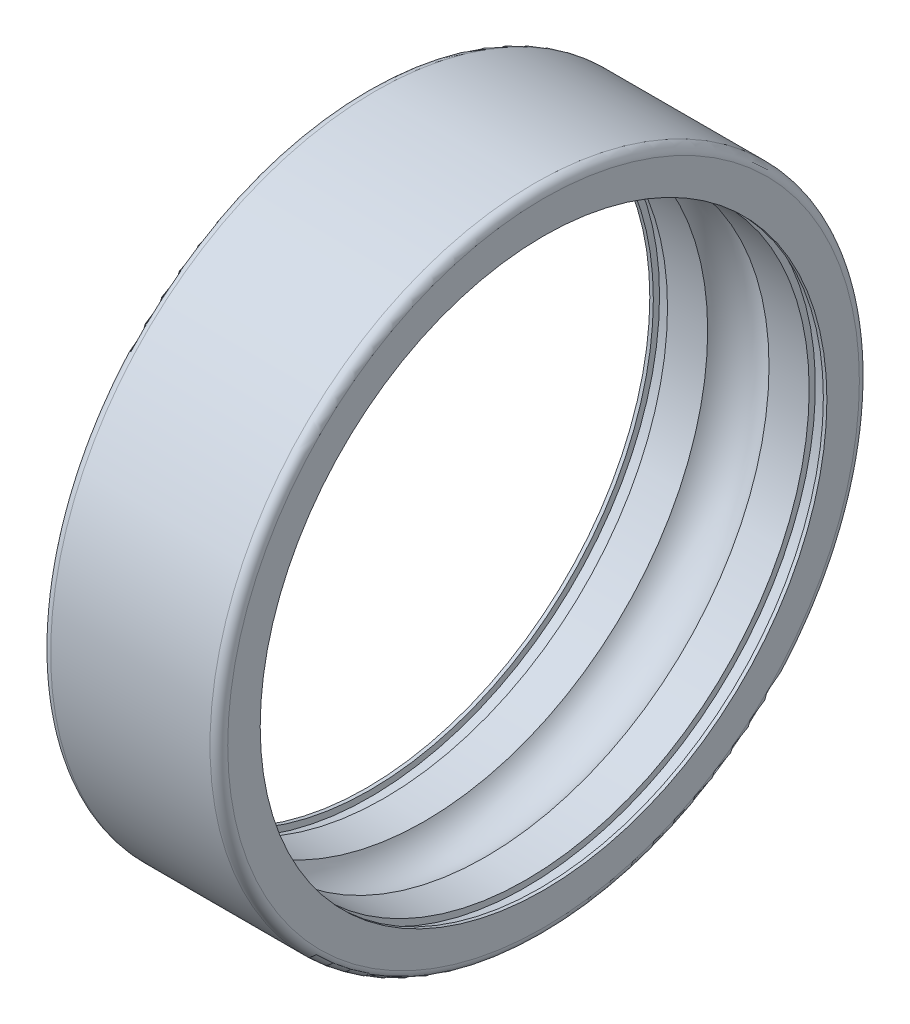
ISO-10303-21;
HEADER;
FILE_DESCRIPTION(('STEP AP214'),'2;1');
FILE_NAME('part.step','',(''),(''),'','','');
FILE_SCHEMA(('AUTOMOTIVE_DESIGN { 1 0 10303 214 1 1 1 1 }'));
ENDSEC;
DATA;
#1=APPLICATION_CONTEXT('core data for automotive mechanical design processes');
#2=APPLICATION_PROTOCOL_DEFINITION('international standard','automotive_design',2000,#1);
#3=PRODUCT_CONTEXT('',#1,'mechanical');
#4=PRODUCT('Part','Part','',(#3));
#5=PRODUCT_RELATED_PRODUCT_CATEGORY('part','',(#4));
#6=PRODUCT_DEFINITION_FORMATION('','',#4);
#7=PRODUCT_DEFINITION_CONTEXT('part definition',#1,'design');
#8=PRODUCT_DEFINITION('design','',#6,#7);
#9=PRODUCT_DEFINITION_SHAPE('','',#8);
#10=(LENGTH_UNIT() NAMED_UNIT(*) SI_UNIT(.MILLI.,.METRE.));
#11=(NAMED_UNIT(*) PLANE_ANGLE_UNIT() SI_UNIT($,.RADIAN.));
#12=(NAMED_UNIT(*) SI_UNIT($,.STERADIAN.) SOLID_ANGLE_UNIT());
#13=UNCERTAINTY_MEASURE_WITH_UNIT(LENGTH_MEASURE(1.E-05),#10,'distance_accuracy_value','');
#14=(GEOMETRIC_REPRESENTATION_CONTEXT(3) GLOBAL_UNCERTAINTY_ASSIGNED_CONTEXT((#13)) GLOBAL_UNIT_ASSIGNED_CONTEXT((#10,
#11,#12)) REPRESENTATION_CONTEXT('',''));
#15=CARTESIAN_POINT('',(0.,0.,0.));
#16=DIRECTION('',(0.,0.,1.));
#17=DIRECTION('',(1.,0.,0.));
#18=AXIS2_PLACEMENT_3D('',#15,#16,#17);
#19=CARTESIAN_POINT('',(2.50980762113533,0.,0.));
#20=DIRECTION('',(-1.,0.,0.));
#21=DIRECTION('',(0.,1.,0.));
#22=AXIS2_PLACEMENT_3D('',#19,#20,#21);
#23=CYLINDRICAL_SURFACE('',#22,4.8);
#24=CARTESIAN_POINT('',(3.,0.,0.));
#25=DIRECTION('',(1.,0.,0.));
#26=DIRECTION('',(0.,1.,0.));
#27=AXIS2_PLACEMENT_3D('',#24,#25,#26);
#28=CIRCLE('',#27,4.8);
#29=CARTESIAN_POINT('',(3.,4.8,0.));
#30=VERTEX_POINT('',#29);
#31=EDGE_CURVE('E11',#30,#30,#28,.T.);
#32=ORIENTED_EDGE('',*,*,#31,.T.);
#33=EDGE_LOOP('',(#32));
#34=FACE_BOUND('',#33,.T.);
#35=CARTESIAN_POINT('',(2.94,0.,0.));
#36=DIRECTION('',(-1.,0.,0.));
#37=DIRECTION('',(0.,1.,0.));
#38=AXIS2_PLACEMENT_3D('',#35,#36,#37);
#39=CIRCLE('',#38,4.8);
#40=CARTESIAN_POINT('',(2.94,-4.8,0.));
#41=VERTEX_POINT('',#40);
#42=EDGE_CURVE('E86',#41,#41,#39,.T.);
#43=ORIENTED_EDGE('',*,*,#42,.T.);
#44=EDGE_LOOP('',(#43));
#45=FACE_BOUND('',#44,.T.);
#46=ADVANCED_FACE('F17',(#34,#45),#23,.F.);
#47=CARTESIAN_POINT('',(3.,5.075,0.));
#48=DIRECTION('',(1.,0.,0.));
#49=DIRECTION('',(0.,1.,0.));
#50=AXIS2_PLACEMENT_3D('',#47,#48,#49);
#51=PLANE('',#50);
#52=CARTESIAN_POINT('',(3.,0.,0.));
#53=DIRECTION('',(1.,0.,0.));
#54=DIRECTION('',(0.,1.,0.));
#55=AXIS2_PLACEMENT_3D('',#52,#53,#54);
#56=CIRCLE('',#55,5.35);
#57=CARTESIAN_POINT('',(3.,5.35,0.));
#58=VERTEX_POINT('',#57);
#59=EDGE_CURVE('E27',#58,#58,#56,.T.);
#60=ORIENTED_EDGE('',*,*,#59,.T.);
#61=EDGE_LOOP('',(#60));
#62=FACE_BOUND('',#61,.T.);
#63=ORIENTED_EDGE('',*,*,#31,.F.);
#64=EDGE_LOOP('',(#63));
#65=FACE_BOUND('',#64,.T.);
#66=ADVANCED_FACE('F117',(#62,#65),#51,.T.);
#67=CARTESIAN_POINT('',(2.85,0.,0.));
#68=DIRECTION('',(1.,0.,0.));
#69=DIRECTION('',(0.,0.,-1.));
#70=AXIS2_PLACEMENT_3D('',#67,#68,#69);
#71=TOROIDAL_SURFACE('',#70,5.35,0.15);
#72=CARTESIAN_POINT('',(2.85,0.,0.));
#73=DIRECTION('',(1.,0.,0.));
#74=DIRECTION('',(0.,1.,0.));
#75=AXIS2_PLACEMENT_3D('',#72,#73,#74);
#76=CIRCLE('',#75,5.5);
#77=CARTESIAN_POINT('',(2.85,5.5,0.));
#78=VERTEX_POINT('',#77);
#79=EDGE_CURVE('E75',#78,#78,#76,.T.);
#80=ORIENTED_EDGE('',*,*,#79,.T.);
#81=EDGE_LOOP('',(#80));
#82=FACE_BOUND('',#81,.T.);
#83=ORIENTED_EDGE('',*,*,#59,.F.);
#84=EDGE_LOOP('',(#83));
#85=FACE_BOUND('',#84,.T.);
#86=ADVANCED_FACE('F76',(#82,#85),#71,.T.);
#87=CARTESIAN_POINT('',(1.5,0.,0.));
#88=DIRECTION('',(-1.,0.,0.));
#89=DIRECTION('',(0.,1.,0.));
#90=AXIS2_PLACEMENT_3D('',#87,#88,#89);
#91=CYLINDRICAL_SURFACE('',#90,5.5);
#92=CARTESIAN_POINT('',(0.15,0.,0.));
#93=DIRECTION('',(1.,0.,0.));
#94=DIRECTION('',(0.,1.,0.));
#95=AXIS2_PLACEMENT_3D('',#92,#93,#94);
#96=CIRCLE('',#95,5.5);
#97=CARTESIAN_POINT('',(0.15,5.5,0.));
#98=VERTEX_POINT('',#97);
#99=EDGE_CURVE('E79',#98,#98,#96,.T.);
#100=ORIENTED_EDGE('',*,*,#99,.T.);
#101=EDGE_LOOP('',(#100));
#102=FACE_BOUND('',#101,.T.);
#103=ORIENTED_EDGE('',*,*,#79,.F.);
#104=EDGE_LOOP('',(#103));
#105=FACE_BOUND('',#104,.T.);
#106=ADVANCED_FACE('F176',(#102,#105),#91,.T.);
#107=CARTESIAN_POINT('',(0.15,0.,0.));
#108=DIRECTION('',(1.,0.,0.));
#109=DIRECTION('',(0.,0.,-1.));
#110=AXIS2_PLACEMENT_3D('',#107,#108,#109);
#111=TOROIDAL_SURFACE('',#110,5.35,0.15);
#112=CARTESIAN_POINT('',(0.,0.,0.));
#113=DIRECTION('',(1.,0.,0.));
#114=DIRECTION('',(0.,1.,0.));
#115=AXIS2_PLACEMENT_3D('',#112,#113,#114);
#116=CIRCLE('',#115,5.35);
#117=CARTESIAN_POINT('',(0.,5.35,0.));
#118=VERTEX_POINT('',#117);
#119=EDGE_CURVE('E81',#118,#118,#116,.T.);
#120=ORIENTED_EDGE('',*,*,#119,.T.);
#121=EDGE_LOOP('',(#120));
#122=FACE_BOUND('',#121,.T.);
#123=ORIENTED_EDGE('',*,*,#99,.F.);
#124=EDGE_LOOP('',(#123));
#125=FACE_BOUND('',#124,.T.);
#126=ADVANCED_FACE('F173',(#122,#125),#111,.T.);
#127=CARTESIAN_POINT('',(0.,5.075,0.));
#128=DIRECTION('',(-1.,0.,0.));
#129=DIRECTION('',(0.,-1.,0.));
#130=AXIS2_PLACEMENT_3D('',#127,#128,#129);
#131=PLANE('',#130);
#132=CARTESIAN_POINT('',(0.,0.,0.));
#133=DIRECTION('',(1.,0.,0.));
#134=DIRECTION('',(0.,1.,0.));
#135=AXIS2_PLACEMENT_3D('',#132,#133,#134);
#136=CIRCLE('',#135,4.8);
#137=CARTESIAN_POINT('',(0.,4.8,0.));
#138=VERTEX_POINT('',#137);
#139=EDGE_CURVE('E95',#138,#138,#136,.T.);
#140=ORIENTED_EDGE('',*,*,#139,.T.);
#141=EDGE_LOOP('',(#140));
#142=FACE_BOUND('',#141,.T.);
#143=ORIENTED_EDGE('',*,*,#119,.F.);
#144=EDGE_LOOP('',(#143));
#145=FACE_BOUND('',#144,.T.);
#146=ADVANCED_FACE('F155',(#142,#145),#131,.T.);
#147=CARTESIAN_POINT('',(0.490192378864669,0.,0.));
#148=DIRECTION('',(-1.,0.,0.));
#149=DIRECTION('',(0.,1.,0.));
#150=AXIS2_PLACEMENT_3D('',#147,#148,#149);
#151=CYLINDRICAL_SURFACE('',#150,4.8);
#152=ORIENTED_EDGE('',*,*,#139,.F.);
#153=EDGE_LOOP('',(#152));
#154=FACE_BOUND('',#153,.T.);
#155=CARTESIAN_POINT('',(0.06,0.,0.));
#156=DIRECTION('',(1.,0.,0.));
#157=DIRECTION('',(0.,1.,0.));
#158=AXIS2_PLACEMENT_3D('',#155,#156,#157);
#159=CIRCLE('',#158,4.8);
#160=CARTESIAN_POINT('',(0.06,-4.8,0.));
#161=VERTEX_POINT('',#160);
#162=EDGE_CURVE('E89',#161,#161,#159,.T.);
#163=ORIENTED_EDGE('',*,*,#162,.T.);
#164=EDGE_LOOP('',(#163));
#165=FACE_BOUND('',#164,.T.);
#166=ADVANCED_FACE('F127',(#154,#165),#151,.F.);
#167=CARTESIAN_POINT('',(1.5,0.,0.));
#168=DIRECTION('',(1.,0.,0.));
#169=DIRECTION('',(0.,0.,-1.));
#170=AXIS2_PLACEMENT_3D('',#167,#168,#169);
#171=TOROIDAL_SURFACE('',#170,4.5,0.6);
#172=CARTESIAN_POINT('',(2.01961524227066,0.,0.));
#173=DIRECTION('',(1.,0.,0.));
#174=DIRECTION('',(0.,1.,0.));
#175=AXIS2_PLACEMENT_3D('',#172,#173,#174);
#176=CIRCLE('',#175,4.8);
#177=CARTESIAN_POINT('',(2.01961524227066,4.8,0.));
#178=VERTEX_POINT('',#177);
#179=EDGE_CURVE('E101',#178,#178,#176,.T.);
#180=ORIENTED_EDGE('',*,*,#179,.T.);
#181=EDGE_LOOP('',(#180));
#182=FACE_BOUND('',#181,.T.);
#183=CARTESIAN_POINT('',(0.980384757729338,0.,0.));
#184=DIRECTION('',(1.,0.,0.));
#185=DIRECTION('',(0.,1.,0.));
#186=AXIS2_PLACEMENT_3D('',#183,#184,#185);
#187=CIRCLE('',#186,4.8);
#188=CARTESIAN_POINT('',(0.980384757729338,4.8,0.));
#189=VERTEX_POINT('',#188);
#190=EDGE_CURVE('E21',#189,#189,#187,.T.);
#191=ORIENTED_EDGE('',*,*,#190,.F.);
#192=EDGE_LOOP('',(#191));
#193=FACE_BOUND('',#192,.T.);
#194=ADVANCED_FACE('F19',(#182,#193),#171,.F.);
#195=CARTESIAN_POINT('',(0.490192378864669,0.,0.));
#196=DIRECTION('',(-1.,0.,0.));
#197=DIRECTION('',(0.,1.,0.));
#198=AXIS2_PLACEMENT_3D('',#195,#196,#197);
#199=CYLINDRICAL_SURFACE('',#198,4.8);
#200=ORIENTED_EDGE('',*,*,#190,.T.);
#201=EDGE_LOOP('',(#200));
#202=FACE_BOUND('',#201,.T.);
#203=CARTESIAN_POINT('',(0.3,0.,0.));
#204=DIRECTION('',(-1.,0.,0.));
#205=DIRECTION('',(0.,1.,0.));
#206=AXIS2_PLACEMENT_3D('',#203,#204,#205);
#207=CIRCLE('',#206,4.8);
#208=CARTESIAN_POINT('',(0.3,-4.8,0.));
#209=VERTEX_POINT('',#208);
#210=EDGE_CURVE('E88',#209,#209,#207,.T.);
#211=ORIENTED_EDGE('',*,*,#210,.T.);
#212=EDGE_LOOP('',(#211));
#213=FACE_BOUND('',#212,.T.);
#214=ADVANCED_FACE('F137',(#202,#213),#199,.F.);
#215=CARTESIAN_POINT('',(0.3,0.,0.));
#216=DIRECTION('',(1.,0.,0.));
#217=DIRECTION('',(0.,0.,-1.));
#218=AXIS2_PLACEMENT_3D('',#215,#216,#217);
#219=PLANE('',#218);
#220=CARTESIAN_POINT('',(0.3,0.,0.));
#221=DIRECTION('',(1.,0.,0.));
#222=DIRECTION('',(0.,0.,-1.));
#223=AXIS2_PLACEMENT_3D('',#220,#221,#222);
#224=CIRCLE('',#223,4.905);
#225=CARTESIAN_POINT('',(0.3,0.,-4.905));
#226=VERTEX_POINT('',#225);
#227=EDGE_CURVE('E94',#226,#226,#224,.T.);
#228=ORIENTED_EDGE('',*,*,#227,.F.);
#229=EDGE_LOOP('',(#228));
#230=FACE_BOUND('',#229,.T.);
#231=ORIENTED_EDGE('',*,*,#210,.F.);
#232=EDGE_LOOP('',(#231));
#233=FACE_BOUND('',#232,.T.);
#234=ADVANCED_FACE('F135',(#230,#233),#219,.F.);
#235=CARTESIAN_POINT('',(0.06,0.,0.));
#236=DIRECTION('',(-1.,0.,0.));
#237=DIRECTION('',(0.,0.,1.));
#238=AXIS2_PLACEMENT_3D('',#235,#236,#237);
#239=PLANE('',#238);
#240=CARTESIAN_POINT('',(0.06,0.,0.));
#241=DIRECTION('',(-1.,0.,0.));
#242=DIRECTION('',(0.,0.,-1.));
#243=AXIS2_PLACEMENT_3D('',#240,#241,#242);
#244=CIRCLE('',#243,4.905);
#245=CARTESIAN_POINT('',(0.06,0.,-4.905));
#246=VERTEX_POINT('',#245);
#247=EDGE_CURVE('E99',#246,#246,#244,.T.);
#248=ORIENTED_EDGE('',*,*,#247,.F.);
#249=EDGE_LOOP('',(#248));
#250=FACE_BOUND('',#249,.T.);
#251=ORIENTED_EDGE('',*,*,#162,.F.);
#252=EDGE_LOOP('',(#251));
#253=FACE_BOUND('',#252,.T.);
#254=ADVANCED_FACE('F132',(#250,#253),#239,.F.);
#255=CARTESIAN_POINT('',(0.18,0.,0.));
#256=DIRECTION('',(-1.,0.,0.));
#257=DIRECTION('',(0.,0.,-1.));
#258=AXIS2_PLACEMENT_3D('',#255,#256,#257);
#259=CYLINDRICAL_SURFACE('',#258,4.905);
#260=ORIENTED_EDGE('',*,*,#227,.T.);
#261=EDGE_LOOP('',(#260));
#262=FACE_BOUND('',#261,.T.);
#263=ORIENTED_EDGE('',*,*,#247,.T.);
#264=EDGE_LOOP('',(#263));
#265=FACE_BOUND('',#264,.T.);
#266=ADVANCED_FACE('F134',(#262,#265),#259,.F.);
#267=CARTESIAN_POINT('',(2.50980762113533,0.,0.));
#268=DIRECTION('',(-1.,0.,0.));
#269=DIRECTION('',(0.,1.,0.));
#270=AXIS2_PLACEMENT_3D('',#267,#268,#269);
#271=CYLINDRICAL_SURFACE('',#270,4.8);
#272=ORIENTED_EDGE('',*,*,#179,.F.);
#273=EDGE_LOOP('',(#272));
#274=FACE_BOUND('',#273,.T.);
#275=CARTESIAN_POINT('',(2.7,0.,0.));
#276=DIRECTION('',(1.,0.,0.));
#277=DIRECTION('',(0.,1.,0.));
#278=AXIS2_PLACEMENT_3D('',#275,#276,#277);
#279=CIRCLE('',#278,4.8);
#280=CARTESIAN_POINT('',(2.7,-4.8,0.));
#281=VERTEX_POINT('',#280);
#282=EDGE_CURVE('E92',#281,#281,#279,.T.);
#283=ORIENTED_EDGE('',*,*,#282,.T.);
#284=EDGE_LOOP('',(#283));
#285=FACE_BOUND('',#284,.T.);
#286=ADVANCED_FACE('F159',(#274,#285),#271,.F.);
#287=CARTESIAN_POINT('',(2.7,0.,0.));
#288=DIRECTION('',(-1.,0.,0.));
#289=DIRECTION('',(0.,0.,1.));
#290=AXIS2_PLACEMENT_3D('',#287,#288,#289);
#291=PLANE('',#290);
#292=CARTESIAN_POINT('',(2.7,0.,0.));
#293=DIRECTION('',(-1.,0.,0.));
#294=DIRECTION('',(0.,0.,1.));
#295=AXIS2_PLACEMENT_3D('',#292,#293,#294);
#296=CIRCLE('',#295,4.905);
#297=CARTESIAN_POINT('',(2.7,0.,4.905));
#298=VERTEX_POINT('',#297);
#299=EDGE_CURVE('E84',#298,#298,#296,.T.);
#300=ORIENTED_EDGE('',*,*,#299,.F.);
#301=EDGE_LOOP('',(#300));
#302=FACE_BOUND('',#301,.T.);
#303=ORIENTED_EDGE('',*,*,#282,.F.);
#304=EDGE_LOOP('',(#303));
#305=FACE_BOUND('',#304,.T.);
#306=ADVANCED_FACE('F112',(#302,#305),#291,.F.);
#307=CARTESIAN_POINT('',(2.94,0.,0.));
#308=DIRECTION('',(1.,0.,0.));
#309=DIRECTION('',(0.,0.,-1.));
#310=AXIS2_PLACEMENT_3D('',#307,#308,#309);
#311=PLANE('',#310);
#312=CARTESIAN_POINT('',(2.94,0.,0.));
#313=DIRECTION('',(1.,0.,0.));
#314=DIRECTION('',(0.,0.,1.));
#315=AXIS2_PLACEMENT_3D('',#312,#313,#314);
#316=CIRCLE('',#315,4.905);
#317=CARTESIAN_POINT('',(2.94,0.,4.905));
#318=VERTEX_POINT('',#317);
#319=EDGE_CURVE('E87',#318,#318,#316,.T.);
#320=ORIENTED_EDGE('',*,*,#319,.F.);
#321=EDGE_LOOP('',(#320));
#322=FACE_BOUND('',#321,.T.);
#323=ORIENTED_EDGE('',*,*,#42,.F.);
#324=EDGE_LOOP('',(#323));
#325=FACE_BOUND('',#324,.T.);
#326=ADVANCED_FACE('F109',(#322,#325),#311,.F.);
#327=CARTESIAN_POINT('',(2.82,0.,0.));
#328=DIRECTION('',(1.,0.,0.));
#329=DIRECTION('',(0.,0.,1.));
#330=AXIS2_PLACEMENT_3D('',#327,#328,#329);
#331=CYLINDRICAL_SURFACE('',#330,4.905);
#332=ORIENTED_EDGE('',*,*,#299,.T.);
#333=EDGE_LOOP('',(#332));
#334=FACE_BOUND('',#333,.T.);
#335=ORIENTED_EDGE('',*,*,#319,.T.);
#336=EDGE_LOOP('',(#335));
#337=FACE_BOUND('',#336,.T.);
#338=ADVANCED_FACE('F107',(#334,#337),#331,.F.);
#339=CLOSED_SHELL('',(#46,#66,#86,#106,#126,#146,#166,#194,#214,#234,#254,#266,#286,#306,#326,#338));
#340=MANIFOLD_SOLID_BREP('B1',#339);
#341=ADVANCED_BREP_SHAPE_REPRESENTATION('',(#18,#340),#14);
#342=SHAPE_DEFINITION_REPRESENTATION(#9,#341);
ENDSEC;
END-ISO-10303-21;
